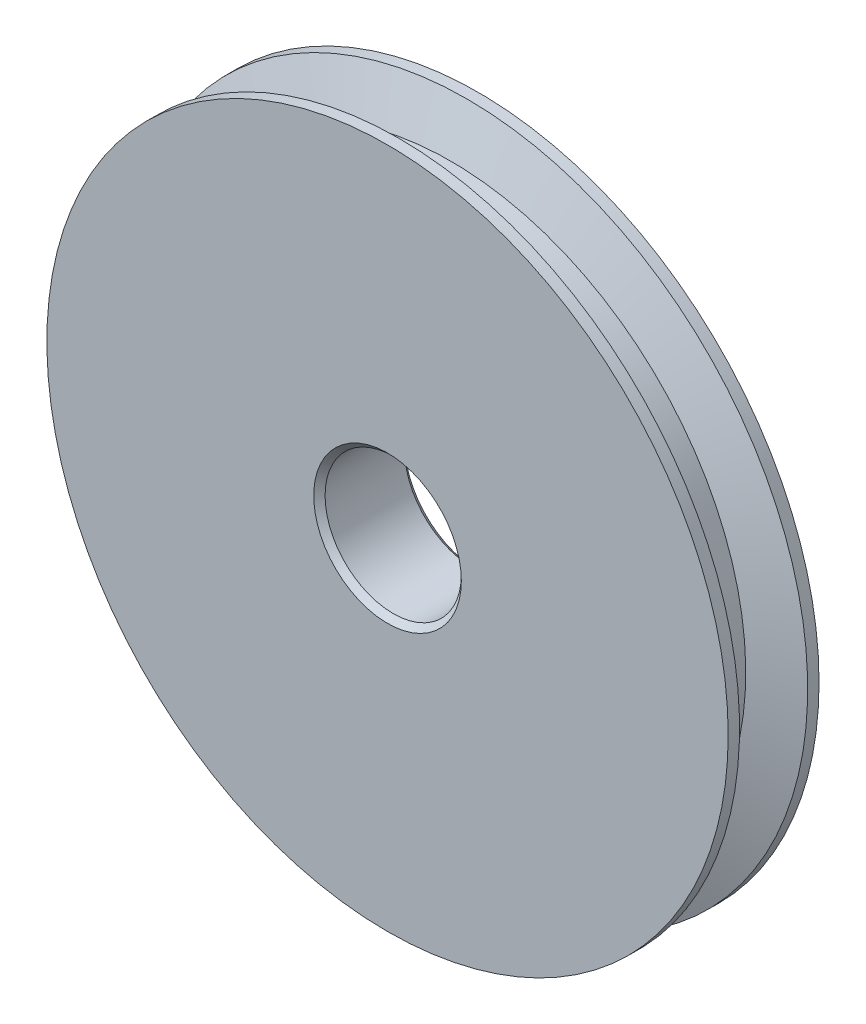
ISO-10303-21;
HEADER;
FILE_DESCRIPTION(('STEP AP214'),'2;1');
FILE_NAME('part.step','',(''),(''),'','','');
FILE_SCHEMA(('AUTOMOTIVE_DESIGN { 1 0 10303 214 1 1 1 1 }'));
ENDSEC;
DATA;
#1=APPLICATION_CONTEXT('core data for automotive mechanical design processes');
#2=APPLICATION_PROTOCOL_DEFINITION('international standard','automotive_design',2000,#1);
#3=PRODUCT_CONTEXT('',#1,'mechanical');
#4=PRODUCT('Part','Part','',(#3));
#5=PRODUCT_RELATED_PRODUCT_CATEGORY('part','',(#4));
#6=PRODUCT_DEFINITION_FORMATION('','',#4);
#7=PRODUCT_DEFINITION_CONTEXT('part definition',#1,'design');
#8=PRODUCT_DEFINITION('design','',#6,#7);
#9=PRODUCT_DEFINITION_SHAPE('','',#8);
#10=(LENGTH_UNIT() NAMED_UNIT(*) SI_UNIT(.MILLI.,.METRE.));
#11=(NAMED_UNIT(*) PLANE_ANGLE_UNIT() SI_UNIT($,.RADIAN.));
#12=(NAMED_UNIT(*) SI_UNIT($,.STERADIAN.) SOLID_ANGLE_UNIT());
#13=UNCERTAINTY_MEASURE_WITH_UNIT(LENGTH_MEASURE(1.E-05),#10,'distance_accuracy_value','');
#14=(GEOMETRIC_REPRESENTATION_CONTEXT(3) GLOBAL_UNCERTAINTY_ASSIGNED_CONTEXT((#13)) GLOBAL_UNIT_ASSIGNED_CONTEXT((#10,
#11,#12)) REPRESENTATION_CONTEXT('',''));
#15=CARTESIAN_POINT('',(0.,0.,0.));
#16=DIRECTION('',(0.,0.,1.));
#17=DIRECTION('',(1.,0.,0.));
#18=AXIS2_PLACEMENT_3D('',#15,#16,#17);
#19=CARTESIAN_POINT('',(0.,0.,6.35));
#20=DIRECTION('',(0.,0.,-1.));
#21=DIRECTION('',(-1.,0.,0.));
#22=AXIS2_PLACEMENT_3D('',#19,#20,#21);
#23=CYLINDRICAL_SURFACE('',#22,47.625);
#24=CARTESIAN_POINT('',(0.,0.,6.35));
#25=DIRECTION('',(0.,0.,1.));
#26=DIRECTION('',(1.,0.,0.));
#27=AXIS2_PLACEMENT_3D('',#24,#25,#26);
#28=CIRCLE('',#27,47.625);
#29=CARTESIAN_POINT('',(47.625,0.,6.35));
#30=VERTEX_POINT('',#29);
#31=EDGE_CURVE('E52',#30,#30,#28,.T.);
#32=ORIENTED_EDGE('',*,*,#31,.F.);
#33=EDGE_LOOP('',(#32));
#34=FACE_BOUND('',#33,.T.);
#35=CARTESIAN_POINT('',(0.,0.,4.76250000000005));
#36=DIRECTION('',(0.,0.,1.));
#37=DIRECTION('',(0.,-1.,0.));
#38=AXIS2_PLACEMENT_3D('',#35,#36,#37);
#39=CIRCLE('',#38,47.625);
#40=CARTESIAN_POINT('',(0.,-47.625,4.7625000000001));
#41=VERTEX_POINT('',#40);
#42=EDGE_CURVE('E56',#41,#41,#39,.T.);
#43=ORIENTED_EDGE('',*,*,#42,.T.);
#44=EDGE_LOOP('',(#43));
#45=FACE_BOUND('',#44,.T.);
#46=ADVANCED_FACE('F32',(#34,#45),#23,.T.);
#47=CARTESIAN_POINT('',(0.,0.,-6.35));
#48=DIRECTION('',(0.,0.,1.));
#49=DIRECTION('',(1.,0.,0.));
#50=AXIS2_PLACEMENT_3D('',#47,#48,#49);
#51=CIRCLE('',#50,47.625);
#52=CARTESIAN_POINT('',(47.625,0.,-6.35));
#53=VERTEX_POINT('',#52);
#54=EDGE_CURVE('E53',#53,#53,#51,.T.);
#55=ORIENTED_EDGE('',*,*,#54,.T.);
#56=EDGE_LOOP('',(#55));
#57=FACE_BOUND('',#56,.T.);
#58=CARTESIAN_POINT('',(0.,0.,-4.76249999999995));
#59=DIRECTION('',(0.,0.,1.));
#60=DIRECTION('',(0.,-1.,0.));
#61=AXIS2_PLACEMENT_3D('',#58,#59,#60);
#62=CIRCLE('',#61,47.625);
#63=CARTESIAN_POINT('',(0.,-47.625,-4.7624999999999));
#64=VERTEX_POINT('',#63);
#65=EDGE_CURVE('E61',#64,#64,#62,.T.);
#66=ORIENTED_EDGE('',*,*,#65,.F.);
#67=EDGE_LOOP('',(#66));
#68=FACE_BOUND('',#67,.T.);
#69=ADVANCED_FACE('F85',(#57,#68),#23,.T.);
#70=CARTESIAN_POINT('',(0.,0.,6.35));
#71=DIRECTION('',(0.,0.,1.));
#72=DIRECTION('',(1.,0.,0.));
#73=AXIS2_PLACEMENT_3D('',#70,#71,#72);
#74=PLANE('',#73);
#75=CARTESIAN_POINT('',(0.,0.,6.35));
#76=DIRECTION('',(0.,0.,1.));
#77=DIRECTION('',(1.,0.,0.));
#78=AXIS2_PLACEMENT_3D('',#75,#76,#77);
#79=CIRCLE('',#78,10.31875);
#80=CARTESIAN_POINT('',(10.31875,0.,6.35));
#81=VERTEX_POINT('',#80);
#82=EDGE_CURVE('E10',#81,#81,#79,.F.);
#83=ORIENTED_EDGE('',*,*,#82,.T.);
#84=EDGE_LOOP('',(#83));
#85=FACE_BOUND('',#84,.T.);
#86=ORIENTED_EDGE('',*,*,#31,.T.);
#87=EDGE_LOOP('',(#86));
#88=FACE_BOUND('',#87,.T.);
#89=ADVANCED_FACE('F91',(#85,#88),#74,.T.);
#90=CARTESIAN_POINT('',(0.,0.,-6.35));
#91=DIRECTION('',(0.,0.,1.));
#92=DIRECTION('',(1.,0.,0.));
#93=AXIS2_PLACEMENT_3D('',#90,#91,#92);
#94=PLANE('',#93);
#95=CARTESIAN_POINT('',(0.,0.,-6.35));
#96=DIRECTION('',(0.,0.,1.));
#97=DIRECTION('',(1.,0.,0.));
#98=AXIS2_PLACEMENT_3D('',#95,#96,#97);
#99=CIRCLE('',#98,10.31875);
#100=CARTESIAN_POINT('',(-10.31875,0.,-6.35));
#101=VERTEX_POINT('',#100);
#102=EDGE_CURVE('E47',#101,#101,#99,.T.);
#103=ORIENTED_EDGE('',*,*,#102,.T.);
#104=EDGE_LOOP('',(#103));
#105=FACE_BOUND('',#104,.T.);
#106=ORIENTED_EDGE('',*,*,#54,.F.);
#107=EDGE_LOOP('',(#106));
#108=FACE_BOUND('',#107,.T.);
#109=ADVANCED_FACE('F96',(#105,#108),#94,.F.);
#110=CARTESIAN_POINT('',(0.,0.,6.35));
#111=DIRECTION('',(0.,0.,-1.));
#112=DIRECTION('',(-1.,0.,0.));
#113=AXIS2_PLACEMENT_3D('',#110,#111,#112);
#114=CYLINDRICAL_SURFACE('',#113,9.525);
#115=CARTESIAN_POINT('',(0.,0.,-5.55624999999998));
#116=DIRECTION('',(0.,0.,1.));
#117=DIRECTION('',(1.,0.,0.));
#118=AXIS2_PLACEMENT_3D('',#115,#116,#117);
#119=CIRCLE('',#118,9.525);
#120=CARTESIAN_POINT('',(-9.525,0.,-5.55624999999998));
#121=VERTEX_POINT('',#120);
#122=EDGE_CURVE('E39',#121,#121,#119,.F.);
#123=ORIENTED_EDGE('',*,*,#122,.T.);
#124=EDGE_LOOP('',(#123));
#125=FACE_BOUND('',#124,.T.);
#126=CARTESIAN_POINT('',(0.,0.,5.55625000000004));
#127=DIRECTION('',(0.,0.,1.));
#128=DIRECTION('',(1.,0.,0.));
#129=AXIS2_PLACEMENT_3D('',#126,#127,#128);
#130=CIRCLE('',#129,9.525);
#131=CARTESIAN_POINT('',(9.525,0.,5.55625000000004));
#132=VERTEX_POINT('',#131);
#133=EDGE_CURVE('E43',#132,#132,#130,.T.);
#134=ORIENTED_EDGE('',*,*,#133,.T.);
#135=EDGE_LOOP('',(#134));
#136=FACE_BOUND('',#135,.T.);
#137=ADVANCED_FACE('F100',(#125,#136),#114,.F.);
#138=CARTESIAN_POINT('',(0.,0.,-6.35));
#139=DIRECTION('',(0.,0.,-1.));
#140=DIRECTION('',(-1.,0.,0.));
#141=AXIS2_PLACEMENT_3D('',#138,#139,#140);
#142=CONICAL_SURFACE('',#141,10.31875,0.785398163397437);
#143=CARTESIAN_POINT('',(-9.525,0.,-5.55624999999998));
#144=CARTESIAN_POINT('',(-9.53326822916667,0.,-5.56451822916665));
#145=CARTESIAN_POINT('',(-9.54153645833333,0.,-5.57278645833332));
#146=CARTESIAN_POINT('',(-9.55807291666667,0.,-5.58932291666665));
#147=CARTESIAN_POINT('',(-9.56634114583333,0.,-5.59759114583332));
#148=CARTESIAN_POINT('',(-9.58287760416667,0.,-5.61412760416665));
#149=CARTESIAN_POINT('',(-9.59114583333333,0.,-5.62239583333332));
#150=CARTESIAN_POINT('',(-9.60768229166667,0.,-5.63893229166665));
#151=CARTESIAN_POINT('',(-9.61595052083334,0.,-5.64720052083332));
#152=CARTESIAN_POINT('',(-9.63248697916667,0.,-5.66373697916665));
#153=CARTESIAN_POINT('',(-9.64075520833333,0.,-5.67200520833332));
#154=CARTESIAN_POINT('',(-9.65729166666667,0.,-5.68854166666665));
#155=CARTESIAN_POINT('',(-9.66555989583333,0.,-5.69680989583332));
#156=CARTESIAN_POINT('',(-9.68209635416667,0.,-5.71334635416665));
#157=CARTESIAN_POINT('',(-9.69036458333333,0.,-5.72161458333332));
#158=CARTESIAN_POINT('',(-9.70690104166667,0.,-5.73815104166665));
#159=CARTESIAN_POINT('',(-9.71516927083333,0.,-5.74641927083332));
#160=CARTESIAN_POINT('',(-9.73170572916667,0.,-5.76295572916665));
#161=CARTESIAN_POINT('',(-9.73997395833333,0.,-5.77122395833332));
#162=CARTESIAN_POINT('',(-9.75651041666667,0.,-5.78776041666665));
#163=CARTESIAN_POINT('',(-9.76477864583333,0.,-5.79602864583332));
#164=CARTESIAN_POINT('',(-9.78131510416667,0.,-5.81256510416666));
#165=CARTESIAN_POINT('',(-9.78958333333333,0.,-5.82083333333332));
#166=CARTESIAN_POINT('',(-9.80611979166667,0.,-5.83736979166666));
#167=CARTESIAN_POINT('',(-9.81438802083333,0.,-5.84563802083332));
#168=CARTESIAN_POINT('',(-9.83092447916667,0.,-5.86217447916666));
#169=CARTESIAN_POINT('',(-9.83919270833333,0.,-5.87044270833332));
#170=CARTESIAN_POINT('',(-9.85572916666667,0.,-5.88697916666666));
#171=CARTESIAN_POINT('',(-9.86399739583333,0.,-5.89524739583332));
#172=CARTESIAN_POINT('',(-9.88053385416667,0.,-5.91178385416666));
#173=CARTESIAN_POINT('',(-9.88880208333333,0.,-5.92005208333332));
#174=CARTESIAN_POINT('',(-9.90533854166667,0.,-5.93658854166666));
#175=CARTESIAN_POINT('',(-9.91360677083333,0.,-5.94485677083332));
#176=CARTESIAN_POINT('',(-9.93014322916667,0.,-5.96139322916666));
#177=CARTESIAN_POINT('',(-9.93841145833333,0.,-5.96966145833332));
#178=CARTESIAN_POINT('',(-9.95494791666667,0.,-5.98619791666666));
#179=CARTESIAN_POINT('',(-9.96321614583333,0.,-5.99446614583333));
#180=CARTESIAN_POINT('',(-9.97975260416667,0.,-6.01100260416666));
#181=CARTESIAN_POINT('',(-9.98802083333334,0.,-6.01927083333333));
#182=CARTESIAN_POINT('',(-10.0045572916667,0.,-6.03580729166666));
#183=CARTESIAN_POINT('',(-10.0128255208333,0.,-6.04407552083333));
#184=CARTESIAN_POINT('',(-10.0293619791667,0.,-6.06061197916666));
#185=CARTESIAN_POINT('',(-10.0376302083333,0.,-6.06888020833333));
#186=CARTESIAN_POINT('',(-10.0541666666667,0.,-6.08541666666666));
#187=CARTESIAN_POINT('',(-10.0624348958333,0.,-6.09368489583333));
#188=CARTESIAN_POINT('',(-10.0789713541667,0.,-6.11022135416666));
#189=CARTESIAN_POINT('',(-10.0872395833333,0.,-6.11848958333333));
#190=CARTESIAN_POINT('',(-10.1037760416667,0.,-6.13502604166666));
#191=CARTESIAN_POINT('',(-10.1120442708333,0.,-6.14329427083333));
#192=CARTESIAN_POINT('',(-10.1285807291667,0.,-6.15983072916666));
#193=CARTESIAN_POINT('',(-10.1368489583333,0.,-6.16809895833333));
#194=CARTESIAN_POINT('',(-10.1533854166667,0.,-6.18463541666666));
#195=CARTESIAN_POINT('',(-10.1616536458333,0.,-6.19290364583333));
#196=CARTESIAN_POINT('',(-10.1781901041667,0.,-6.20944010416666));
#197=CARTESIAN_POINT('',(-10.1864583333333,0.,-6.21770833333333));
#198=CARTESIAN_POINT('',(-10.2029947916667,0.,-6.23424479166666));
#199=CARTESIAN_POINT('',(-10.2112630208333,0.,-6.24251302083333));
#200=CARTESIAN_POINT('',(-10.2277994791667,0.,-6.25904947916666));
#201=CARTESIAN_POINT('',(-10.2360677083333,0.,-6.26731770833333));
#202=CARTESIAN_POINT('',(-10.2526041666667,0.,-6.28385416666667));
#203=CARTESIAN_POINT('',(-10.2608723958333,0.,-6.29212239583333));
#204=CARTESIAN_POINT('',(-10.2774088541667,0.,-6.30865885416667));
#205=CARTESIAN_POINT('',(-10.2856770833333,0.,-6.31692708333333));
#206=CARTESIAN_POINT('',(-10.3022135416667,0.,-6.33346354166667));
#207=CARTESIAN_POINT('',(-10.3104817708333,0.,-6.34173177083333));
#208=CARTESIAN_POINT('',(-10.31875,0.,-6.35));
#209=B_SPLINE_CURVE_WITH_KNOTS('',3,(#143,#144,#145,#146,#147,#148,#149,#150,#151,#152,#153,
#154,#155,#156,#157,#158,#159,#160,#161,#162,#163,#164,#165,#166,#167,#168,#169,#170,#171,#172,
#173,#174,#175,#176,#177,#178,#179,#180,#181,#182,#183,#184,#185,#186,#187,#188,#189,#190,#191,
#192,#193,#194,#195,#196,#197,#198,#199,#200,#201,#202,#203,#204,#205,#206,#207,#208),
.UNSPECIFIED.,.F.,.F.,(4,2,2,2,2,2,2,2,2,2,2,2,2,2,2,2,2,2,2,2,2,2,2,2,2,2,2,2,2,2,2,2,4),(0.,
0.0350791254729274,0.0701582509458536,0.10523737641878,0.140316501891708,0.175395627364634,
0.21047475283756,0.245553878310488,0.280633003783414,0.315712129256341,0.350791254729269,
0.385870380202195,0.420949505675121,0.456028631148049,0.491107756620975,0.526186882093902,
0.56126600756683,0.596345133039756,0.631424258512682,0.66650338398561,0.701582509458536,
0.736661634931463,0.77174076040439,0.806819885877317,0.841899011350244,0.876978136823171,
0.912057262296097,0.947136387769025,0.982215513241951,1.01729463871488,1.05237376418781,
1.08745288966073,1.12253201513366),.UNSPECIFIED.);
#210=EDGE_CURVE('BSEAM98',#121,#101,#209,.T.);
#211=ORIENTED_EDGE('',*,*,#122,.F.);
#212=ORIENTED_EDGE('',*,*,#102,.F.);
#213=ORIENTED_EDGE('',*,*,#210,.T.);
#214=ORIENTED_EDGE('',*,*,#210,.F.);
#215=EDGE_LOOP('',(#211,#213,#212,#214));
#216=FACE_BOUND('',#215,.T.);
#217=ADVANCED_FACE('F98',(#216),#142,.F.);
#218=CARTESIAN_POINT('',(0.,0.,5.55625000000004));
#219=DIRECTION('',(0.,0.,1.));
#220=DIRECTION('',(1.,0.,0.));
#221=AXIS2_PLACEMENT_3D('',#218,#219,#220);
#222=CONICAL_SURFACE('',#221,9.525,0.785398163397455);
#223=ORIENTED_EDGE('',*,*,#82,.F.);
#224=EDGE_LOOP('',(#223));
#225=FACE_BOUND('',#224,.T.);
#226=ORIENTED_EDGE('',*,*,#133,.F.);
#227=EDGE_LOOP('',(#226));
#228=FACE_BOUND('',#227,.T.);
#229=ADVANCED_FACE('F34',(#225,#228),#222,.F.);
#230=CARTESIAN_POINT('',(0.,0.,4.76250000000005));
#231=DIRECTION('',(0.,0.,1.));
#232=DIRECTION('',(0.,-1.,0.));
#233=AXIS2_PLACEMENT_3D('',#230,#231,#232);
#234=CONICAL_SURFACE('',#233,47.625,1.22173047639603);
#235=CARTESIAN_POINT('',(0.,0.,2.45128901240968));
#236=DIRECTION('',(0.,0.,1.));
#237=DIRECTION('',(0.,-1.,0.));
#238=AXIS2_PLACEMENT_3D('',#235,#236,#237);
#239=CIRCLE('',#238,41.275);
#240=CARTESIAN_POINT('',(0.,-41.275,2.45128901240972));
#241=VERTEX_POINT('',#240);
#242=EDGE_CURVE('E67',#241,#241,#239,.T.);
#243=ORIENTED_EDGE('',*,*,#242,.T.);
#244=EDGE_LOOP('',(#243));
#245=FACE_BOUND('',#244,.T.);
#246=ORIENTED_EDGE('',*,*,#42,.F.);
#247=EDGE_LOOP('',(#246));
#248=FACE_BOUND('',#247,.T.);
#249=ADVANCED_FACE('F71',(#245,#248),#234,.T.);
#250=CARTESIAN_POINT('',(0.,0.,-2.45128901240959));
#251=DIRECTION('',(0.,0.,-1.));
#252=DIRECTION('',(0.,1.,0.));
#253=AXIS2_PLACEMENT_3D('',#250,#251,#252);
#254=CONICAL_SURFACE('',#253,41.275,1.22173047639603);
#255=ORIENTED_EDGE('',*,*,#65,.T.);
#256=EDGE_LOOP('',(#255));
#257=FACE_BOUND('',#256,.T.);
#258=CARTESIAN_POINT('',(0.,0.,-2.45128901240959));
#259=DIRECTION('',(0.,0.,1.));
#260=DIRECTION('',(0.,-1.,0.));
#261=AXIS2_PLACEMENT_3D('',#258,#259,#260);
#262=CIRCLE('',#261,41.275);
#263=CARTESIAN_POINT('',(0.,-41.275,-2.45128901240954));
#264=VERTEX_POINT('',#263);
#265=EDGE_CURVE('E64',#264,#264,#262,.T.);
#266=ORIENTED_EDGE('',*,*,#265,.F.);
#267=EDGE_LOOP('',(#266));
#268=FACE_BOUND('',#267,.T.);
#269=ADVANCED_FACE('F76',(#257,#268),#254,.T.);
#270=CARTESIAN_POINT('',(0.,0.,6.35));
#271=DIRECTION('',(0.,0.,1.));
#272=DIRECTION('',(0.,-1.,0.));
#273=AXIS2_PLACEMENT_3D('',#270,#271,#272);
#274=CYLINDRICAL_SURFACE('',#273,41.275);
#275=ORIENTED_EDGE('',*,*,#265,.T.);
#276=EDGE_LOOP('',(#275));
#277=FACE_BOUND('',#276,.T.);
#278=ORIENTED_EDGE('',*,*,#242,.F.);
#279=EDGE_LOOP('',(#278));
#280=FACE_BOUND('',#279,.T.);
#281=ADVANCED_FACE('F74',(#277,#280),#274,.T.);
#282=CLOSED_SHELL('',(#46,#69,#89,#109,#137,#217,#229,#249,#269,#281));
#283=MANIFOLD_SOLID_BREP('B2',#282);
#284=ADVANCED_BREP_SHAPE_REPRESENTATION('',(#18,#283),#14);
#285=SHAPE_DEFINITION_REPRESENTATION(#9,#284);
ENDSEC;
END-ISO-10303-21;
